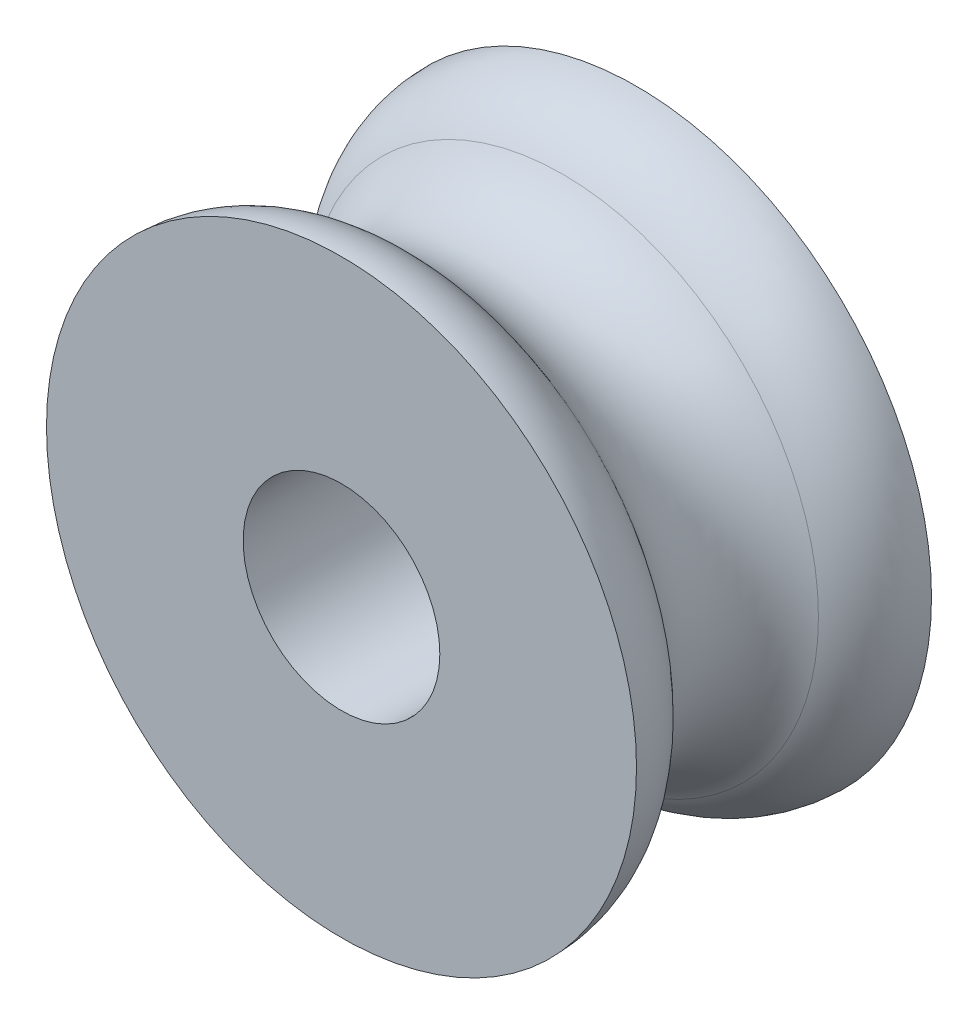
ISO-10303-21;
HEADER;
FILE_DESCRIPTION(('STEP AP214'),'2;1');
FILE_NAME('part.step','',(''),(''),'','','');
FILE_SCHEMA(('AUTOMOTIVE_DESIGN { 1 0 10303 214 1 1 1 1 }'));
ENDSEC;
DATA;
#1=APPLICATION_CONTEXT('core data for automotive mechanical design processes');
#2=APPLICATION_PROTOCOL_DEFINITION('international standard','automotive_design',2000,#1);
#3=PRODUCT_CONTEXT('',#1,'mechanical');
#4=PRODUCT('Part','Part','',(#3));
#5=PRODUCT_RELATED_PRODUCT_CATEGORY('part','',(#4));
#6=PRODUCT_DEFINITION_FORMATION('','',#4);
#7=PRODUCT_DEFINITION_CONTEXT('part definition',#1,'design');
#8=PRODUCT_DEFINITION('design','',#6,#7);
#9=PRODUCT_DEFINITION_SHAPE('','',#8);
#10=(LENGTH_UNIT() NAMED_UNIT(*) SI_UNIT(.MILLI.,.METRE.));
#11=(NAMED_UNIT(*) PLANE_ANGLE_UNIT() SI_UNIT($,.RADIAN.));
#12=(NAMED_UNIT(*) SI_UNIT($,.STERADIAN.) SOLID_ANGLE_UNIT());
#13=UNCERTAINTY_MEASURE_WITH_UNIT(LENGTH_MEASURE(1.E-05),#10,'distance_accuracy_value','');
#14=(GEOMETRIC_REPRESENTATION_CONTEXT(3) GLOBAL_UNCERTAINTY_ASSIGNED_CONTEXT((#13)) GLOBAL_UNIT_ASSIGNED_CONTEXT((#10,
#11,#12)) REPRESENTATION_CONTEXT('',''));
#15=CARTESIAN_POINT('',(0.,0.,0.));
#16=DIRECTION('',(0.,0.,1.));
#17=DIRECTION('',(1.,0.,0.));
#18=AXIS2_PLACEMENT_3D('',#15,#16,#17);
#19=CARTESIAN_POINT('',(0.,6.,3.));
#20=DIRECTION('',(0.,0.,-1.));
#21=DIRECTION('',(-1.,0.,0.));
#22=AXIS2_PLACEMENT_3D('',#19,#20,#21);
#23=PLANE('',#22);
#24=CARTESIAN_POINT('',(0.,0.,3.));
#25=DIRECTION('',(0.,0.,1.));
#26=DIRECTION('',(1.,0.,0.));
#27=AXIS2_PLACEMENT_3D('',#24,#25,#26);
#28=CIRCLE('',#27,2.);
#29=CARTESIAN_POINT('',(2.,0.,3.));
#30=VERTEX_POINT('',#29);
#31=EDGE_CURVE('E10',#30,#30,#28,.T.);
#32=ORIENTED_EDGE('',*,*,#31,.F.);
#33=EDGE_LOOP('',(#32));
#34=FACE_BOUND('',#33,.T.);
#35=CARTESIAN_POINT('',(0.,0.,3.));
#36=DIRECTION('',(0.,0.,1.));
#37=DIRECTION('',(1.,0.,0.));
#38=AXIS2_PLACEMENT_3D('',#35,#36,#37);
#39=CIRCLE('',#38,6.);
#40=CARTESIAN_POINT('',(6.,0.,3.));
#41=VERTEX_POINT('',#40);
#42=EDGE_CURVE('E53',#41,#41,#39,.T.);
#43=ORIENTED_EDGE('',*,*,#42,.T.);
#44=EDGE_LOOP('',(#43));
#45=FACE_BOUND('',#44,.T.);
#46=ADVANCED_FACE('F31',(#34,#45),#23,.F.);
#47=CARTESIAN_POINT('',(0.,0.,0.));
#48=DIRECTION('',(0.,0.,1.));
#49=DIRECTION('',(1.,0.,0.));
#50=AXIS2_PLACEMENT_3D('',#47,#48,#49);
#51=CYLINDRICAL_SURFACE('',#50,2.);
#52=CARTESIAN_POINT('',(0.,0.,-3.));
#53=DIRECTION('',(0.,0.,1.));
#54=DIRECTION('',(1.,0.,0.));
#55=AXIS2_PLACEMENT_3D('',#52,#53,#54);
#56=CIRCLE('',#55,2.);
#57=CARTESIAN_POINT('',(2.,0.,-3.));
#58=VERTEX_POINT('',#57);
#59=EDGE_CURVE('E37',#58,#58,#56,.T.);
#60=ORIENTED_EDGE('',*,*,#59,.F.);
#61=EDGE_LOOP('',(#60));
#62=FACE_BOUND('',#61,.T.);
#63=ORIENTED_EDGE('',*,*,#31,.T.);
#64=EDGE_LOOP('',(#63));
#65=FACE_BOUND('',#64,.T.);
#66=ADVANCED_FACE('F78',(#62,#65),#51,.F.);
#67=CARTESIAN_POINT('',(0.,2.,-3.));
#68=DIRECTION('',(0.,0.,1.));
#69=DIRECTION('',(1.,0.,0.));
#70=AXIS2_PLACEMENT_3D('',#67,#68,#69);
#71=PLANE('',#70);
#72=CARTESIAN_POINT('',(0.,0.,-3.));
#73=DIRECTION('',(0.,0.,1.));
#74=DIRECTION('',(1.,0.,0.));
#75=AXIS2_PLACEMENT_3D('',#72,#73,#74);
#76=CIRCLE('',#75,6.);
#77=CARTESIAN_POINT('',(6.,0.,-3.));
#78=VERTEX_POINT('',#77);
#79=EDGE_CURVE('E41',#78,#78,#76,.T.);
#80=ORIENTED_EDGE('',*,*,#79,.F.);
#81=EDGE_LOOP('',(#80));
#82=FACE_BOUND('',#81,.T.);
#83=ORIENTED_EDGE('',*,*,#59,.T.);
#84=EDGE_LOOP('',(#83));
#85=FACE_BOUND('',#84,.T.);
#86=ADVANCED_FACE('F73',(#82,#85),#71,.F.);
#87=CARTESIAN_POINT('',(0.,0.,-3.));
#88=DIRECTION('',(0.,0.,1.));
#89=DIRECTION('',(1.,0.,0.));
#90=AXIS2_PLACEMENT_3D('',#87,#88,#89);
#91=TOROIDAL_SURFACE('',#90,4.19375,1.80625);
#92=CARTESIAN_POINT('',(0.,0.,-1.5));
#93=DIRECTION('',(0.,0.,1.));
#94=DIRECTION('',(1.,0.,0.));
#95=AXIS2_PLACEMENT_3D('',#92,#93,#94);
#96=CIRCLE('',#95,5.2);
#97=CARTESIAN_POINT('',(5.2,0.,-1.5));
#98=VERTEX_POINT('',#97);
#99=EDGE_CURVE('E45',#98,#98,#96,.T.);
#100=ORIENTED_EDGE('',*,*,#99,.F.);
#101=EDGE_LOOP('',(#100));
#102=FACE_BOUND('',#101,.T.);
#103=ORIENTED_EDGE('',*,*,#79,.T.);
#104=EDGE_LOOP('',(#103));
#105=FACE_BOUND('',#104,.T.);
#106=ADVANCED_FACE('F67',(#102,#105),#91,.T.);
#107=CARTESIAN_POINT('',(0.,0.,0.));
#108=DIRECTION('',(0.,0.,1.));
#109=DIRECTION('',(1.,0.,0.));
#110=AXIS2_PLACEMENT_3D('',#107,#108,#109);
#111=TOROIDAL_SURFACE('',#110,6.20625,1.80625);
#112=CARTESIAN_POINT('',(0.,0.,1.5));
#113=DIRECTION('',(0.,0.,1.));
#114=DIRECTION('',(1.,0.,0.));
#115=AXIS2_PLACEMENT_3D('',#112,#113,#114);
#116=CIRCLE('',#115,5.2);
#117=CARTESIAN_POINT('',(5.2,0.,1.5));
#118=VERTEX_POINT('',#117);
#119=EDGE_CURVE('E50',#118,#118,#116,.T.);
#120=ORIENTED_EDGE('',*,*,#119,.F.);
#121=EDGE_LOOP('',(#120));
#122=FACE_BOUND('',#121,.T.);
#123=ORIENTED_EDGE('',*,*,#99,.T.);
#124=EDGE_LOOP('',(#123));
#125=FACE_BOUND('',#124,.T.);
#126=ADVANCED_FACE('F61',(#122,#125),#111,.F.);
#127=CARTESIAN_POINT('',(0.,0.,3.));
#128=DIRECTION('',(0.,0.,1.));
#129=DIRECTION('',(1.,0.,0.));
#130=AXIS2_PLACEMENT_3D('',#127,#128,#129);
#131=TOROIDAL_SURFACE('',#130,4.19375,1.80625);
#132=ORIENTED_EDGE('',*,*,#42,.F.);
#133=EDGE_LOOP('',(#132));
#134=FACE_BOUND('',#133,.T.);
#135=ORIENTED_EDGE('',*,*,#119,.T.);
#136=EDGE_LOOP('',(#135));
#137=FACE_BOUND('',#136,.T.);
#138=ADVANCED_FACE('F58',(#134,#137),#131,.T.);
#139=CLOSED_SHELL('',(#46,#66,#86,#106,#126,#138));
#140=MANIFOLD_SOLID_BREP('B2',#139);
#141=ADVANCED_BREP_SHAPE_REPRESENTATION('',(#18,#140),#14);
#142=SHAPE_DEFINITION_REPRESENTATION(#9,#141);
ENDSEC;
END-ISO-10303-21;
